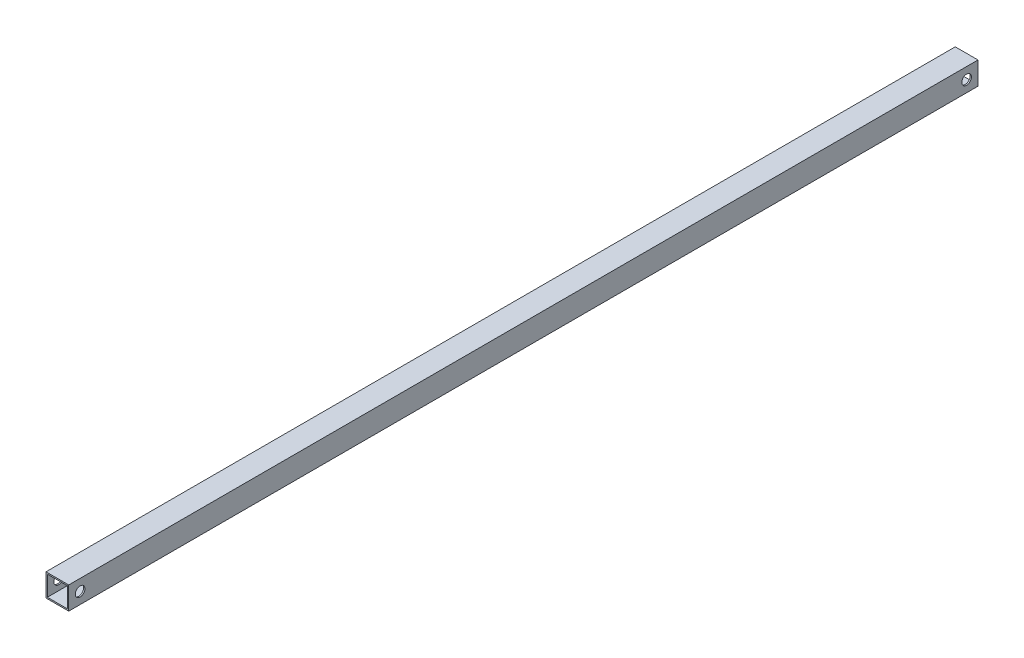
ISO-10303-21;
HEADER;
FILE_DESCRIPTION(('STEP AP214'),'2;1');
FILE_NAME('part.step','',(''),(''),'','','');
FILE_SCHEMA(('AUTOMOTIVE_DESIGN { 1 0 10303 214 1 1 1 1 }'));
ENDSEC;
DATA;
#1=APPLICATION_CONTEXT('core data for automotive mechanical design processes');
#2=APPLICATION_PROTOCOL_DEFINITION('international standard','automotive_design',2000,#1);
#3=PRODUCT_CONTEXT('',#1,'mechanical');
#4=PRODUCT('Part','Part','',(#3));
#5=PRODUCT_RELATED_PRODUCT_CATEGORY('part','',(#4));
#6=PRODUCT_DEFINITION_FORMATION('','',#4);
#7=PRODUCT_DEFINITION_CONTEXT('part definition',#1,'design');
#8=PRODUCT_DEFINITION('design','',#6,#7);
#9=PRODUCT_DEFINITION_SHAPE('','',#8);
#10=(LENGTH_UNIT() NAMED_UNIT(*) SI_UNIT(.MILLI.,.METRE.));
#11=(NAMED_UNIT(*) PLANE_ANGLE_UNIT() SI_UNIT($,.RADIAN.));
#12=(NAMED_UNIT(*) SI_UNIT($,.STERADIAN.) SOLID_ANGLE_UNIT());
#13=UNCERTAINTY_MEASURE_WITH_UNIT(LENGTH_MEASURE(1.E-05),#10,'distance_accuracy_value','');
#14=(GEOMETRIC_REPRESENTATION_CONTEXT(3) GLOBAL_UNCERTAINTY_ASSIGNED_CONTEXT((#13)) GLOBAL_UNIT_ASSIGNED_CONTEXT((#10,
#11,#12)) REPRESENTATION_CONTEXT('',''));
#15=CARTESIAN_POINT('',(0.,0.,0.));
#16=DIRECTION('',(0.,0.,1.));
#17=DIRECTION('',(1.,0.,0.));
#18=AXIS2_PLACEMENT_3D('',#15,#16,#17);
#19=CARTESIAN_POINT('',(0.,0.,800.));
#20=DIRECTION('',(0.,0.,1.));
#21=DIRECTION('',(1.,0.,0.));
#22=AXIS2_PLACEMENT_3D('',#19,#20,#21);
#23=PLANE('',#22);
#24=DIRECTION('',(0.,-1.,0.));
#25=VECTOR('',#24,1.);
#26=CARTESIAN_POINT('',(-10.,-10.,800.));
#27=LINE('',#26,#25);
#28=CARTESIAN_POINT('',(-10.,9.99999999999999,800.));
#29=VERTEX_POINT('',#28);
#30=CARTESIAN_POINT('',(-10.,-10.,800.));
#31=VERTEX_POINT('',#30);
#32=EDGE_CURVE('E142',#29,#31,#27,.T.);
#33=ORIENTED_EDGE('',*,*,#32,.T.);
#34=DIRECTION('',(1.,0.,0.));
#35=VECTOR('',#34,1.);
#36=CARTESIAN_POINT('',(10.,-10.,800.));
#37=LINE('',#36,#35);
#38=CARTESIAN_POINT('',(10.,-10.,800.));
#39=VERTEX_POINT('',#38);
#40=EDGE_CURVE('E145',#31,#39,#37,.T.);
#41=ORIENTED_EDGE('',*,*,#40,.T.);
#42=DIRECTION('',(0.,1.,0.));
#43=VECTOR('',#42,1.);
#44=CARTESIAN_POINT('',(10.,-10.,800.));
#45=LINE('',#44,#43);
#46=CARTESIAN_POINT('',(10.,10.,800.));
#47=VERTEX_POINT('',#46);
#48=EDGE_CURVE('E148',#39,#47,#45,.T.);
#49=ORIENTED_EDGE('',*,*,#48,.T.);
#50=DIRECTION('',(-1.,0.,0.));
#51=VECTOR('',#50,1.);
#52=CARTESIAN_POINT('',(10.,10.,800.));
#53=LINE('',#52,#51);
#54=EDGE_CURVE('E150',#47,#29,#53,.T.);
#55=ORIENTED_EDGE('',*,*,#54,.T.);
#56=EDGE_LOOP('',(#33,#41,#49,#55));
#57=FACE_BOUND('',#56,.T.);
#58=DIRECTION('',(0.,1.,0.));
#59=VECTOR('',#58,1.);
#60=CARTESIAN_POINT('',(8.8,-8.8,800.));
#61=LINE('',#60,#59);
#62=CARTESIAN_POINT('',(8.8,-8.8,800.));
#63=VERTEX_POINT('',#62);
#64=CARTESIAN_POINT('',(8.8,8.8,800.));
#65=VERTEX_POINT('',#64);
#66=EDGE_CURVE('E112',#63,#65,#61,.T.);
#67=ORIENTED_EDGE('',*,*,#66,.F.);
#68=DIRECTION('',(1.,0.,0.));
#69=VECTOR('',#68,1.);
#70=CARTESIAN_POINT('',(8.8,-8.8,800.));
#71=LINE('',#70,#69);
#72=CARTESIAN_POINT('',(-8.8,-8.8,800.));
#73=VERTEX_POINT('',#72);
#74=EDGE_CURVE('E104',#73,#63,#71,.T.);
#75=ORIENTED_EDGE('',*,*,#74,.F.);
#76=DIRECTION('',(0.,-1.,0.));
#77=VECTOR('',#76,1.);
#78=CARTESIAN_POINT('',(-8.8,-8.8,800.));
#79=LINE('',#78,#77);
#80=CARTESIAN_POINT('',(-8.8,8.8,800.));
#81=VERTEX_POINT('',#80);
#82=EDGE_CURVE('E126',#81,#73,#79,.T.);
#83=ORIENTED_EDGE('',*,*,#82,.F.);
#84=DIRECTION('',(-1.,0.,0.));
#85=VECTOR('',#84,1.);
#86=CARTESIAN_POINT('',(8.8,8.8,800.));
#87=LINE('',#86,#85);
#88=EDGE_CURVE('E124',#65,#81,#87,.T.);
#89=ORIENTED_EDGE('',*,*,#88,.F.);
#90=EDGE_LOOP('',(#67,#75,#83,#89));
#91=FACE_BOUND('',#90,.T.);
#92=ADVANCED_FACE('F37',(#57,#91),#23,.T.);
#93=CARTESIAN_POINT('',(0.,0.,0.));
#94=DIRECTION('',(0.,0.,1.));
#95=DIRECTION('',(1.,0.,0.));
#96=AXIS2_PLACEMENT_3D('',#93,#94,#95);
#97=PLANE('',#96);
#98=DIRECTION('',(0.,-1.,0.));
#99=VECTOR('',#98,1.);
#100=CARTESIAN_POINT('',(-10.,-10.,0.));
#101=LINE('',#100,#99);
#102=CARTESIAN_POINT('',(-10.,9.99999999999999,0.));
#103=VERTEX_POINT('',#102);
#104=CARTESIAN_POINT('',(-10.,-10.,0.));
#105=VERTEX_POINT('',#104);
#106=EDGE_CURVE('E120',#103,#105,#101,.T.);
#107=ORIENTED_EDGE('',*,*,#106,.F.);
#108=DIRECTION('',(-1.,0.,0.));
#109=VECTOR('',#108,1.);
#110=CARTESIAN_POINT('',(10.,10.,0.));
#111=LINE('',#110,#109);
#112=CARTESIAN_POINT('',(10.,10.,0.));
#113=VERTEX_POINT('',#112);
#114=EDGE_CURVE('E146',#113,#103,#111,.T.);
#115=ORIENTED_EDGE('',*,*,#114,.F.);
#116=DIRECTION('',(0.,1.,0.));
#117=VECTOR('',#116,1.);
#118=CARTESIAN_POINT('',(10.,-10.,0.));
#119=LINE('',#118,#117);
#120=CARTESIAN_POINT('',(10.,-10.,0.));
#121=VERTEX_POINT('',#120);
#122=EDGE_CURVE('E157',#121,#113,#119,.T.);
#123=ORIENTED_EDGE('',*,*,#122,.F.);
#124=DIRECTION('',(1.,0.,0.));
#125=VECTOR('',#124,1.);
#126=CARTESIAN_POINT('',(10.,-10.,0.));
#127=LINE('',#126,#125);
#128=EDGE_CURVE('E155',#105,#121,#127,.T.);
#129=ORIENTED_EDGE('',*,*,#128,.F.);
#130=EDGE_LOOP('',(#107,#115,#123,#129));
#131=FACE_BOUND('',#130,.T.);
#132=DIRECTION('',(1.,0.,0.));
#133=VECTOR('',#132,1.);
#134=CARTESIAN_POINT('',(8.8,-8.8,0.));
#135=LINE('',#134,#133);
#136=CARTESIAN_POINT('',(-8.8,-8.8,0.));
#137=VERTEX_POINT('',#136);
#138=CARTESIAN_POINT('',(8.8,-8.8,0.));
#139=VERTEX_POINT('',#138);
#140=EDGE_CURVE('E62',#137,#139,#135,.T.);
#141=ORIENTED_EDGE('',*,*,#140,.T.);
#142=DIRECTION('',(0.,1.,0.));
#143=VECTOR('',#142,1.);
#144=CARTESIAN_POINT('',(8.8,-8.8,0.));
#145=LINE('',#144,#143);
#146=CARTESIAN_POINT('',(8.8,8.8,0.));
#147=VERTEX_POINT('',#146);
#148=EDGE_CURVE('E119',#139,#147,#145,.T.);
#149=ORIENTED_EDGE('',*,*,#148,.T.);
#150=DIRECTION('',(-1.,0.,0.));
#151=VECTOR('',#150,1.);
#152=CARTESIAN_POINT('',(8.8,8.8,0.));
#153=LINE('',#152,#151);
#154=CARTESIAN_POINT('',(-8.8,8.8,0.));
#155=VERTEX_POINT('',#154);
#156=EDGE_CURVE('E134',#147,#155,#153,.T.);
#157=ORIENTED_EDGE('',*,*,#156,.T.);
#158=DIRECTION('',(0.,-1.,0.));
#159=VECTOR('',#158,1.);
#160=CARTESIAN_POINT('',(-8.8,-8.8,0.));
#161=LINE('',#160,#159);
#162=EDGE_CURVE('E113',#155,#137,#161,.T.);
#163=ORIENTED_EDGE('',*,*,#162,.T.);
#164=EDGE_LOOP('',(#141,#149,#157,#163));
#165=FACE_BOUND('',#164,.T.);
#166=ADVANCED_FACE('F204',(#131,#165),#97,.F.);
#167=CARTESIAN_POINT('',(-10.,-10.,800.));
#168=DIRECTION('',(1.,0.,0.));
#169=DIRECTION('',(0.,0.,-1.));
#170=AXIS2_PLACEMENT_3D('',#167,#168,#169);
#171=PLANE('',#170);
#172=CARTESIAN_POINT('',(-10.,0.,10.));
#173=DIRECTION('',(1.,0.,0.));
#174=DIRECTION('',(0.,0.,-1.));
#175=AXIS2_PLACEMENT_3D('',#172,#173,#174);
#176=CIRCLE('',#175,4.25);
#177=CARTESIAN_POINT('',(-10.,0.,5.75));
#178=VERTEX_POINT('',#177);
#179=EDGE_CURVE('E169',#178,#178,#176,.T.);
#180=ORIENTED_EDGE('',*,*,#179,.T.);
#181=EDGE_LOOP('',(#180));
#182=FACE_BOUND('',#181,.T.);
#183=CARTESIAN_POINT('',(-10.,0.,790.));
#184=DIRECTION('',(1.,0.,0.));
#185=DIRECTION('',(0.,0.,-1.));
#186=AXIS2_PLACEMENT_3D('',#183,#184,#185);
#187=CIRCLE('',#186,4.25);
#188=CARTESIAN_POINT('',(-10.,0.,785.75));
#189=VERTEX_POINT('',#188);
#190=EDGE_CURVE('E185',#189,#189,#187,.T.);
#191=ORIENTED_EDGE('',*,*,#190,.T.);
#192=EDGE_LOOP('',(#191));
#193=FACE_BOUND('',#192,.T.);
#194=ORIENTED_EDGE('',*,*,#106,.T.);
#195=DIRECTION('',(0.,0.,-1.));
#196=VECTOR('',#195,1.);
#197=CARTESIAN_POINT('',(-10.,-10.,800.));
#198=LINE('',#197,#196);
#199=EDGE_CURVE('E11',#31,#105,#198,.T.);
#200=ORIENTED_EDGE('',*,*,#199,.F.);
#201=ORIENTED_EDGE('',*,*,#32,.F.);
#202=DIRECTION('',(0.,0.,-1.));
#203=VECTOR('',#202,1.);
#204=CARTESIAN_POINT('',(-10.,9.99999999999999,800.));
#205=LINE('',#204,#203);
#206=EDGE_CURVE('E152',#29,#103,#205,.T.);
#207=ORIENTED_EDGE('',*,*,#206,.T.);
#208=EDGE_LOOP('',(#194,#200,#201,#207));
#209=FACE_BOUND('',#208,.T.);
#210=ADVANCED_FACE('F39',(#182,#193,#209),#171,.F.);
#211=CARTESIAN_POINT('',(10.,-10.,800.));
#212=DIRECTION('',(0.,1.,0.));
#213=DIRECTION('',(-1.,0.,0.));
#214=AXIS2_PLACEMENT_3D('',#211,#212,#213);
#215=PLANE('',#214);
#216=ORIENTED_EDGE('',*,*,#128,.T.);
#217=DIRECTION('',(0.,0.,-1.));
#218=VECTOR('',#217,1.);
#219=CARTESIAN_POINT('',(10.,-10.,800.));
#220=LINE('',#219,#218);
#221=EDGE_CURVE('E46',#39,#121,#220,.T.);
#222=ORIENTED_EDGE('',*,*,#221,.F.);
#223=ORIENTED_EDGE('',*,*,#40,.F.);
#224=ORIENTED_EDGE('',*,*,#199,.T.);
#225=EDGE_LOOP('',(#216,#222,#223,#224));
#226=FACE_BOUND('',#225,.T.);
#227=ADVANCED_FACE('F229',(#226),#215,.F.);
#228=CARTESIAN_POINT('',(10.,-10.,800.));
#229=DIRECTION('',(-1.,0.,0.));
#230=DIRECTION('',(0.,0.,1.));
#231=AXIS2_PLACEMENT_3D('',#228,#229,#230);
#232=PLANE('',#231);
#233=CARTESIAN_POINT('',(10.,0.,10.));
#234=DIRECTION('',(1.,0.,0.));
#235=DIRECTION('',(0.,0.,-1.));
#236=AXIS2_PLACEMENT_3D('',#233,#234,#235);
#237=CIRCLE('',#236,4.25);
#238=CARTESIAN_POINT('',(10.,0.,5.75));
#239=VERTEX_POINT('',#238);
#240=EDGE_CURVE('E175',#239,#239,#237,.T.);
#241=ORIENTED_EDGE('',*,*,#240,.F.);
#242=EDGE_LOOP('',(#241));
#243=FACE_BOUND('',#242,.T.);
#244=CARTESIAN_POINT('',(10.,0.,790.));
#245=DIRECTION('',(1.,0.,0.));
#246=DIRECTION('',(0.,0.,-1.));
#247=AXIS2_PLACEMENT_3D('',#244,#245,#246);
#248=CIRCLE('',#247,4.25);
#249=CARTESIAN_POINT('',(10.,0.,785.75));
#250=VERTEX_POINT('',#249);
#251=EDGE_CURVE('E180',#250,#250,#248,.T.);
#252=ORIENTED_EDGE('',*,*,#251,.F.);
#253=EDGE_LOOP('',(#252));
#254=FACE_BOUND('',#253,.T.);
#255=ORIENTED_EDGE('',*,*,#122,.T.);
#256=DIRECTION('',(0.,0.,-1.));
#257=VECTOR('',#256,1.);
#258=CARTESIAN_POINT('',(10.,10.,800.));
#259=LINE('',#258,#257);
#260=EDGE_CURVE('E162',#47,#113,#259,.T.);
#261=ORIENTED_EDGE('',*,*,#260,.F.);
#262=ORIENTED_EDGE('',*,*,#48,.F.);
#263=ORIENTED_EDGE('',*,*,#221,.T.);
#264=EDGE_LOOP('',(#255,#261,#262,#263));
#265=FACE_BOUND('',#264,.T.);
#266=ADVANCED_FACE('F226',(#243,#254,#265),#232,.F.);
#267=CARTESIAN_POINT('',(10.,10.,800.));
#268=DIRECTION('',(0.,-1.,0.));
#269=DIRECTION('',(1.,0.,0.));
#270=AXIS2_PLACEMENT_3D('',#267,#268,#269);
#271=PLANE('',#270);
#272=ORIENTED_EDGE('',*,*,#114,.T.);
#273=ORIENTED_EDGE('',*,*,#206,.F.);
#274=ORIENTED_EDGE('',*,*,#54,.F.);
#275=ORIENTED_EDGE('',*,*,#260,.T.);
#276=EDGE_LOOP('',(#272,#273,#274,#275));
#277=FACE_BOUND('',#276,.T.);
#278=ADVANCED_FACE('F223',(#277),#271,.F.);
#279=CARTESIAN_POINT('',(8.8,-8.8,800.));
#280=DIRECTION('',(0.,1.,0.));
#281=DIRECTION('',(-1.,0.,0.));
#282=AXIS2_PLACEMENT_3D('',#279,#280,#281);
#283=PLANE('',#282);
#284=ORIENTED_EDGE('',*,*,#140,.F.);
#285=DIRECTION('',(0.,0.,-1.));
#286=VECTOR('',#285,1.);
#287=CARTESIAN_POINT('',(-8.8,-8.8,800.));
#288=LINE('',#287,#286);
#289=EDGE_CURVE('E108',#73,#137,#288,.T.);
#290=ORIENTED_EDGE('',*,*,#289,.F.);
#291=ORIENTED_EDGE('',*,*,#74,.T.);
#292=DIRECTION('',(0.,0.,-1.));
#293=VECTOR('',#292,1.);
#294=CARTESIAN_POINT('',(8.8,-8.8,800.));
#295=LINE('',#294,#293);
#296=EDGE_CURVE('E107',#63,#139,#295,.T.);
#297=ORIENTED_EDGE('',*,*,#296,.T.);
#298=EDGE_LOOP('',(#284,#290,#291,#297));
#299=FACE_BOUND('',#298,.T.);
#300=ADVANCED_FACE('F106',(#299),#283,.T.);
#301=CARTESIAN_POINT('',(8.8,-8.8,800.));
#302=DIRECTION('',(-1.,0.,0.));
#303=DIRECTION('',(0.,0.,1.));
#304=AXIS2_PLACEMENT_3D('',#301,#302,#303);
#305=PLANE('',#304);
#306=CARTESIAN_POINT('',(8.8,0.,10.));
#307=DIRECTION('',(-1.,0.,0.));
#308=DIRECTION('',(0.,0.,1.));
#309=AXIS2_PLACEMENT_3D('',#306,#307,#308);
#310=CIRCLE('',#309,4.25);
#311=CARTESIAN_POINT('',(8.8,0.,14.25));
#312=VERTEX_POINT('',#311);
#313=EDGE_CURVE('E132',#312,#312,#310,.T.);
#314=ORIENTED_EDGE('',*,*,#313,.F.);
#315=EDGE_LOOP('',(#314));
#316=FACE_BOUND('',#315,.T.);
#317=CARTESIAN_POINT('',(8.8,0.,790.));
#318=DIRECTION('',(-1.,0.,0.));
#319=DIRECTION('',(0.,0.,1.));
#320=AXIS2_PLACEMENT_3D('',#317,#318,#319);
#321=CIRCLE('',#320,4.25);
#322=CARTESIAN_POINT('',(8.8,0.,794.25));
#323=VERTEX_POINT('',#322);
#324=EDGE_CURVE('E168',#323,#323,#321,.T.);
#325=ORIENTED_EDGE('',*,*,#324,.F.);
#326=EDGE_LOOP('',(#325));
#327=FACE_BOUND('',#326,.T.);
#328=ORIENTED_EDGE('',*,*,#148,.F.);
#329=ORIENTED_EDGE('',*,*,#296,.F.);
#330=ORIENTED_EDGE('',*,*,#66,.T.);
#331=DIRECTION('',(0.,0.,-1.));
#332=VECTOR('',#331,1.);
#333=CARTESIAN_POINT('',(8.8,8.8,800.));
#334=LINE('',#333,#332);
#335=EDGE_CURVE('E121',#65,#147,#334,.T.);
#336=ORIENTED_EDGE('',*,*,#335,.T.);
#337=EDGE_LOOP('',(#328,#329,#330,#336));
#338=FACE_BOUND('',#337,.T.);
#339=ADVANCED_FACE('F116',(#316,#327,#338),#305,.T.);
#340=CARTESIAN_POINT('',(8.8,8.8,800.));
#341=DIRECTION('',(0.,-1.,0.));
#342=DIRECTION('',(1.,0.,0.));
#343=AXIS2_PLACEMENT_3D('',#340,#341,#342);
#344=PLANE('',#343);
#345=ORIENTED_EDGE('',*,*,#156,.F.);
#346=ORIENTED_EDGE('',*,*,#335,.F.);
#347=ORIENTED_EDGE('',*,*,#88,.T.);
#348=DIRECTION('',(0.,0.,-1.));
#349=VECTOR('',#348,1.);
#350=CARTESIAN_POINT('',(-8.8,8.8,800.));
#351=LINE('',#350,#349);
#352=EDGE_CURVE('E54',#81,#155,#351,.T.);
#353=ORIENTED_EDGE('',*,*,#352,.T.);
#354=EDGE_LOOP('',(#345,#346,#347,#353));
#355=FACE_BOUND('',#354,.T.);
#356=ADVANCED_FACE('F200',(#355),#344,.T.);
#357=CARTESIAN_POINT('',(-8.8,-8.8,800.));
#358=DIRECTION('',(1.,0.,0.));
#359=DIRECTION('',(0.,0.,-1.));
#360=AXIS2_PLACEMENT_3D('',#357,#358,#359);
#361=PLANE('',#360);
#362=CARTESIAN_POINT('',(-8.8,0.,10.));
#363=DIRECTION('',(1.,0.,0.));
#364=DIRECTION('',(0.,0.,-1.));
#365=AXIS2_PLACEMENT_3D('',#362,#363,#364);
#366=CIRCLE('',#365,4.25);
#367=CARTESIAN_POINT('',(-8.8,0.,5.75));
#368=VERTEX_POINT('',#367);
#369=EDGE_CURVE('E41',#368,#368,#366,.T.);
#370=ORIENTED_EDGE('',*,*,#369,.F.);
#371=EDGE_LOOP('',(#370));
#372=FACE_BOUND('',#371,.T.);
#373=CARTESIAN_POINT('',(-8.8,0.,790.));
#374=DIRECTION('',(1.,0.,0.));
#375=DIRECTION('',(0.,0.,-1.));
#376=AXIS2_PLACEMENT_3D('',#373,#374,#375);
#377=CIRCLE('',#376,4.25);
#378=CARTESIAN_POINT('',(-8.8,0.,785.75));
#379=VERTEX_POINT('',#378);
#380=EDGE_CURVE('E166',#379,#379,#377,.T.);
#381=ORIENTED_EDGE('',*,*,#380,.F.);
#382=EDGE_LOOP('',(#381));
#383=FACE_BOUND('',#382,.T.);
#384=ORIENTED_EDGE('',*,*,#162,.F.);
#385=ORIENTED_EDGE('',*,*,#352,.F.);
#386=ORIENTED_EDGE('',*,*,#82,.T.);
#387=ORIENTED_EDGE('',*,*,#289,.T.);
#388=EDGE_LOOP('',(#384,#385,#386,#387));
#389=FACE_BOUND('',#388,.T.);
#390=ADVANCED_FACE('F196',(#372,#383,#389),#361,.T.);
#391=CARTESIAN_POINT('',(-10.,0.,790.));
#392=DIRECTION('',(1.,0.,0.));
#393=DIRECTION('',(0.,0.,-1.));
#394=AXIS2_PLACEMENT_3D('',#391,#392,#393);
#395=CYLINDRICAL_SURFACE('',#394,4.25);
#396=ORIENTED_EDGE('',*,*,#380,.T.);
#397=EDGE_LOOP('',(#396));
#398=FACE_BOUND('',#397,.T.);
#399=ORIENTED_EDGE('',*,*,#190,.F.);
#400=EDGE_LOOP('',(#399));
#401=FACE_BOUND('',#400,.T.);
#402=ADVANCED_FACE('F199',(#398,#401),#395,.F.);
#403=CARTESIAN_POINT('',(-10.,0.,10.));
#404=DIRECTION('',(1.,0.,0.));
#405=DIRECTION('',(0.,0.,-1.));
#406=AXIS2_PLACEMENT_3D('',#403,#404,#405);
#407=CYLINDRICAL_SURFACE('',#406,4.25);
#408=ORIENTED_EDGE('',*,*,#369,.T.);
#409=EDGE_LOOP('',(#408));
#410=FACE_BOUND('',#409,.T.);
#411=ORIENTED_EDGE('',*,*,#179,.F.);
#412=EDGE_LOOP('',(#411));
#413=FACE_BOUND('',#412,.T.);
#414=ADVANCED_FACE('F193',(#410,#413),#407,.F.);
#415=ORIENTED_EDGE('',*,*,#324,.T.);
#416=EDGE_LOOP('',(#415));
#417=FACE_BOUND('',#416,.T.);
#418=ORIENTED_EDGE('',*,*,#251,.T.);
#419=EDGE_LOOP('',(#418));
#420=FACE_BOUND('',#419,.T.);
#421=ADVANCED_FACE('F255',(#417,#420),#395,.F.);
#422=ORIENTED_EDGE('',*,*,#313,.T.);
#423=EDGE_LOOP('',(#422));
#424=FACE_BOUND('',#423,.T.);
#425=ORIENTED_EDGE('',*,*,#240,.T.);
#426=EDGE_LOOP('',(#425));
#427=FACE_BOUND('',#426,.T.);
#428=ADVANCED_FACE('F260',(#424,#427),#407,.F.);
#429=CLOSED_SHELL('',(#92,#166,#210,#227,#266,#278,#300,#339,#356,#390,#402,#414,#421,#428));
#430=MANIFOLD_SOLID_BREP('B2',#429);
#431=ADVANCED_BREP_SHAPE_REPRESENTATION('',(#18,#430),#14);
#432=SHAPE_DEFINITION_REPRESENTATION(#9,#431);
ENDSEC;
END-ISO-10303-21;
